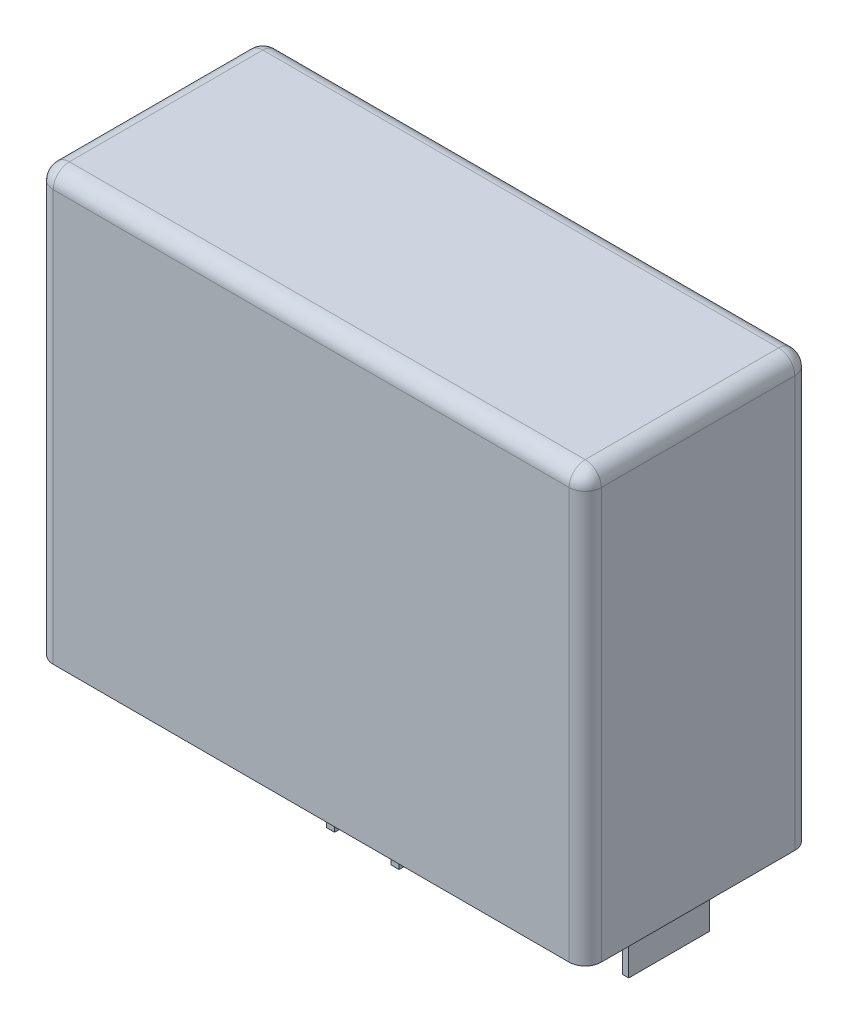
ISO-10303-21;
HEADER;
FILE_DESCRIPTION(('STEP AP214'),'2;1');
FILE_NAME('part.step','',(''),(''),'','','');
FILE_SCHEMA(('AUTOMOTIVE_DESIGN { 1 0 10303 214 1 1 1 1 }'));
ENDSEC;
DATA;
#1=APPLICATION_CONTEXT('core data for automotive mechanical design processes');
#2=APPLICATION_PROTOCOL_DEFINITION('international standard','automotive_design',2000,#1);
#3=PRODUCT_CONTEXT('',#1,'mechanical');
#4=PRODUCT('Part','Part','',(#3));
#5=PRODUCT_RELATED_PRODUCT_CATEGORY('part','',(#4));
#6=PRODUCT_DEFINITION_FORMATION('','',#4);
#7=PRODUCT_DEFINITION_CONTEXT('part definition',#1,'design');
#8=PRODUCT_DEFINITION('design','',#6,#7);
#9=PRODUCT_DEFINITION_SHAPE('','',#8);
#10=(LENGTH_UNIT() NAMED_UNIT(*) SI_UNIT(.MILLI.,.METRE.));
#11=(NAMED_UNIT(*) PLANE_ANGLE_UNIT() SI_UNIT($,.RADIAN.));
#12=(NAMED_UNIT(*) SI_UNIT($,.STERADIAN.) SOLID_ANGLE_UNIT());
#13=UNCERTAINTY_MEASURE_WITH_UNIT(LENGTH_MEASURE(1.E-05),#10,'distance_accuracy_value','');
#14=(GEOMETRIC_REPRESENTATION_CONTEXT(3) GLOBAL_UNCERTAINTY_ASSIGNED_CONTEXT((#13)) GLOBAL_UNIT_ASSIGNED_CONTEXT((#10,
#11,#12)) REPRESENTATION_CONTEXT('',''));
#15=CARTESIAN_POINT('',(0.,0.,0.));
#16=DIRECTION('',(0.,0.,1.));
#17=DIRECTION('',(1.,0.,0.));
#18=AXIS2_PLACEMENT_3D('',#15,#16,#17);
#19=CARTESIAN_POINT('',(16.,0.,-6.));
#20=DIRECTION('',(0.,-1.,0.));
#21=DIRECTION('',(0.,0.,-1.));
#22=AXIS2_PLACEMENT_3D('',#19,#20,#21);
#23=PLANE('',#22);
#24=CARTESIAN_POINT('',(16.,0.,-6.));
#25=DIRECTION('',(0.,1.,0.));
#26=DIRECTION('',(0.,0.,-1.));
#27=AXIS2_PLACEMENT_3D('',#24,#25,#26);
#28=CIRCLE('',#27,1.);
#29=CARTESIAN_POINT('',(17.,0.,-5.99999999999999));
#30=VERTEX_POINT('',#29);
#31=CARTESIAN_POINT('',(16.,0.,-7.));
#32=VERTEX_POINT('',#31);
#33=EDGE_CURVE('E326',#30,#32,#28,.T.);
#34=ORIENTED_EDGE('',*,*,#33,.F.);
#35=DIRECTION('',(0.,0.,-1.));
#36=VECTOR('',#35,1.);
#37=CARTESIAN_POINT('',(17.,0.,5.99999999999999));
#38=LINE('',#37,#36);
#39=CARTESIAN_POINT('',(17.,0.,5.99999999999999));
#40=VERTEX_POINT('',#39);
#41=EDGE_CURVE('E347',#40,#30,#38,.T.);
#42=ORIENTED_EDGE('',*,*,#41,.F.);
#43=CARTESIAN_POINT('',(16.,0.,6.));
#44=DIRECTION('',(0.,1.,0.));
#45=DIRECTION('',(0.,0.,-1.));
#46=AXIS2_PLACEMENT_3D('',#43,#44,#45);
#47=CIRCLE('',#46,1.);
#48=CARTESIAN_POINT('',(16.,0.,7.));
#49=VERTEX_POINT('',#48);
#50=EDGE_CURVE('E344',#49,#40,#47,.T.);
#51=ORIENTED_EDGE('',*,*,#50,.F.);
#52=DIRECTION('',(1.,0.,0.));
#53=VECTOR('',#52,1.);
#54=CARTESIAN_POINT('',(-16.,0.,7.));
#55=LINE('',#54,#53);
#56=CARTESIAN_POINT('',(-16.,0.,7.));
#57=VERTEX_POINT('',#56);
#58=EDGE_CURVE('E341',#57,#49,#55,.T.);
#59=ORIENTED_EDGE('',*,*,#58,.F.);
#60=CARTESIAN_POINT('',(-16.,0.,6.));
#61=DIRECTION('',(0.,1.,0.));
#62=DIRECTION('',(0.,0.,1.));
#63=AXIS2_PLACEMENT_3D('',#60,#61,#62);
#64=CIRCLE('',#63,1.);
#65=CARTESIAN_POINT('',(-17.,0.,5.99999999999999));
#66=VERTEX_POINT('',#65);
#67=EDGE_CURVE('E338',#66,#57,#64,.T.);
#68=ORIENTED_EDGE('',*,*,#67,.F.);
#69=DIRECTION('',(0.,0.,1.));
#70=VECTOR('',#69,1.);
#71=CARTESIAN_POINT('',(-17.,0.,5.99999999999999));
#72=LINE('',#71,#70);
#73=CARTESIAN_POINT('',(-17.,0.,-5.99999999999999));
#74=VERTEX_POINT('',#73);
#75=EDGE_CURVE('E335',#74,#66,#72,.T.);
#76=ORIENTED_EDGE('',*,*,#75,.F.);
#77=CARTESIAN_POINT('',(-16.,0.,-6.));
#78=DIRECTION('',(0.,1.,0.));
#79=DIRECTION('',(0.,0.,-1.));
#80=AXIS2_PLACEMENT_3D('',#77,#78,#79);
#81=CIRCLE('',#80,1.);
#82=CARTESIAN_POINT('',(-16.,0.,-7.));
#83=VERTEX_POINT('',#82);
#84=EDGE_CURVE('E332',#83,#74,#81,.T.);
#85=ORIENTED_EDGE('',*,*,#84,.F.);
#86=DIRECTION('',(-1.,0.,0.));
#87=VECTOR('',#86,1.);
#88=CARTESIAN_POINT('',(-16.,0.,-7.));
#89=LINE('',#88,#87);
#90=EDGE_CURVE('E329',#32,#83,#89,.T.);
#91=ORIENTED_EDGE('',*,*,#90,.F.);
#92=EDGE_LOOP('',(#34,#42,#51,#59,#68,#76,#85,#91));
#93=FACE_BOUND('',#92,.T.);
#94=DIRECTION('',(-1.,0.,0.));
#95=VECTOR('',#94,1.);
#96=CARTESIAN_POINT('',(-15.2,0.,2.5));
#97=LINE('',#96,#95);
#98=CARTESIAN_POINT('',(-14.8,0.,2.5));
#99=VERTEX_POINT('',#98);
#100=CARTESIAN_POINT('',(-15.2,0.,2.5));
#101=VERTEX_POINT('',#100);
#102=EDGE_CURVE('E311',#99,#101,#97,.T.);
#103=ORIENTED_EDGE('',*,*,#102,.F.);
#104=DIRECTION('',(0.,0.,1.));
#105=VECTOR('',#104,1.);
#106=CARTESIAN_POINT('',(-14.8,0.,-2.5));
#107=LINE('',#106,#105);
#108=CARTESIAN_POINT('',(-14.8,0.,-2.5));
#109=VERTEX_POINT('',#108);
#110=EDGE_CURVE('E297',#109,#99,#107,.T.);
#111=ORIENTED_EDGE('',*,*,#110,.F.);
#112=DIRECTION('',(1.,0.,0.));
#113=VECTOR('',#112,1.);
#114=CARTESIAN_POINT('',(-15.2,0.,-2.5));
#115=LINE('',#114,#113);
#116=CARTESIAN_POINT('',(-15.2,0.,-2.5));
#117=VERTEX_POINT('',#116);
#118=EDGE_CURVE('E302',#117,#109,#115,.T.);
#119=ORIENTED_EDGE('',*,*,#118,.F.);
#120=DIRECTION('',(0.,0.,-1.));
#121=VECTOR('',#120,1.);
#122=CARTESIAN_POINT('',(-15.2,0.,-2.5));
#123=LINE('',#122,#121);
#124=EDGE_CURVE('E313',#101,#117,#123,.T.);
#125=ORIENTED_EDGE('',*,*,#124,.F.);
#126=EDGE_LOOP('',(#103,#111,#119,#125));
#127=FACE_BOUND('',#126,.T.);
#128=DIRECTION('',(-1.,0.,0.));
#129=VECTOR('',#128,1.);
#130=CARTESIAN_POINT('',(14.8,0.,2.5));
#131=LINE('',#130,#129);
#132=CARTESIAN_POINT('',(15.2,0.,2.5));
#133=VERTEX_POINT('',#132);
#134=CARTESIAN_POINT('',(14.8,0.,2.5));
#135=VERTEX_POINT('',#134);
#136=EDGE_CURVE('E282',#133,#135,#131,.T.);
#137=ORIENTED_EDGE('',*,*,#136,.F.);
#138=DIRECTION('',(0.,0.,1.));
#139=VECTOR('',#138,1.);
#140=CARTESIAN_POINT('',(15.2,0.,-2.5));
#141=LINE('',#140,#139);
#142=CARTESIAN_POINT('',(15.2,0.,-2.5));
#143=VERTEX_POINT('',#142);
#144=EDGE_CURVE('E268',#143,#133,#141,.T.);
#145=ORIENTED_EDGE('',*,*,#144,.F.);
#146=DIRECTION('',(1.,0.,0.));
#147=VECTOR('',#146,1.);
#148=CARTESIAN_POINT('',(14.8,0.,-2.5));
#149=LINE('',#148,#147);
#150=CARTESIAN_POINT('',(14.8,0.,-2.5));
#151=VERTEX_POINT('',#150);
#152=EDGE_CURVE('E273',#151,#143,#149,.T.);
#153=ORIENTED_EDGE('',*,*,#152,.F.);
#154=DIRECTION('',(0.,0.,-1.));
#155=VECTOR('',#154,1.);
#156=CARTESIAN_POINT('',(14.8,0.,-2.5));
#157=LINE('',#156,#155);
#158=EDGE_CURVE('E284',#135,#151,#157,.T.);
#159=ORIENTED_EDGE('',*,*,#158,.F.);
#160=EDGE_LOOP('',(#137,#145,#153,#159));
#161=FACE_BOUND('',#160,.T.);
#162=DIRECTION('',(1.,0.,0.));
#163=VECTOR('',#162,1.);
#164=CARTESIAN_POINT('',(2.25,0.,2.8));
#165=LINE('',#164,#163);
#166=CARTESIAN_POINT('',(1.75,0.,2.8));
#167=VERTEX_POINT('',#166);
#168=CARTESIAN_POINT('',(2.25,0.,2.8));
#169=VERTEX_POINT('',#168);
#170=EDGE_CURVE('E237',#167,#169,#165,.T.);
#171=ORIENTED_EDGE('',*,*,#170,.F.);
#172=DIRECTION('',(0.,0.,-1.));
#173=VECTOR('',#172,1.);
#174=CARTESIAN_POINT('',(1.75,0.,3.8));
#175=LINE('',#174,#173);
#176=CARTESIAN_POINT('',(1.75,0.,3.8));
#177=VERTEX_POINT('',#176);
#178=EDGE_CURVE('E234',#177,#167,#175,.T.);
#179=ORIENTED_EDGE('',*,*,#178,.F.);
#180=DIRECTION('',(-1.,0.,0.));
#181=VECTOR('',#180,1.);
#182=CARTESIAN_POINT('',(2.25,0.,3.8));
#183=LINE('',#182,#181);
#184=CARTESIAN_POINT('',(2.25,0.,3.8));
#185=VERTEX_POINT('',#184);
#186=EDGE_CURVE('E247',#185,#177,#183,.T.);
#187=ORIENTED_EDGE('',*,*,#186,.F.);
#188=DIRECTION('',(0.,0.,1.));
#189=VECTOR('',#188,1.);
#190=CARTESIAN_POINT('',(2.25,0.,3.8));
#191=LINE('',#190,#189);
#192=EDGE_CURVE('E255',#169,#185,#191,.T.);
#193=ORIENTED_EDGE('',*,*,#192,.F.);
#194=EDGE_LOOP('',(#171,#179,#187,#193));
#195=FACE_BOUND('',#194,.T.);
#196=DIRECTION('',(1.,0.,0.));
#197=VECTOR('',#196,1.);
#198=CARTESIAN_POINT('',(-1.75,0.,2.8));
#199=LINE('',#198,#197);
#200=CARTESIAN_POINT('',(-2.25,0.,2.8));
#201=VERTEX_POINT('',#200);
#202=CARTESIAN_POINT('',(-1.75,0.,2.8));
#203=VERTEX_POINT('',#202);
#204=EDGE_CURVE('E413',#201,#203,#199,.T.);
#205=ORIENTED_EDGE('',*,*,#204,.F.);
#206=DIRECTION('',(0.,0.,-1.));
#207=VECTOR('',#206,1.);
#208=CARTESIAN_POINT('',(-2.25,0.,3.8));
#209=LINE('',#208,#207);
#210=CARTESIAN_POINT('',(-2.25,0.,3.8));
#211=VERTEX_POINT('',#210);
#212=EDGE_CURVE('E232',#211,#201,#209,.T.);
#213=ORIENTED_EDGE('',*,*,#212,.F.);
#214=DIRECTION('',(-1.,0.,0.));
#215=VECTOR('',#214,1.);
#216=CARTESIAN_POINT('',(-1.75,0.,3.8));
#217=LINE('',#216,#215);
#218=CARTESIAN_POINT('',(-1.75,0.,3.8));
#219=VERTEX_POINT('',#218);
#220=EDGE_CURVE('E228',#219,#211,#217,.T.);
#221=ORIENTED_EDGE('',*,*,#220,.F.);
#222=DIRECTION('',(0.,0.,1.));
#223=VECTOR('',#222,1.);
#224=CARTESIAN_POINT('',(-1.75,0.,3.8));
#225=LINE('',#224,#223);
#226=EDGE_CURVE('E415',#203,#219,#225,.T.);
#227=ORIENTED_EDGE('',*,*,#226,.F.);
#228=EDGE_LOOP('',(#205,#213,#221,#227));
#229=FACE_BOUND('',#228,.T.);
#230=ADVANCED_FACE('F35',(#93,#127,#161,#195,#229),#23,.T.);
#231=CARTESIAN_POINT('',(16.,26.5,-6.));
#232=DIRECTION('',(0.,-1.,0.));
#233=DIRECTION('',(0.,0.,-1.));
#234=AXIS2_PLACEMENT_3D('',#231,#232,#233);
#235=CYLINDRICAL_SURFACE('',#234,1.);
#236=DIRECTION('',(0.,-1.,0.));
#237=VECTOR('',#236,1.);
#238=CARTESIAN_POINT('',(16.,26.5,-7.));
#239=LINE('',#238,#237);
#240=CARTESIAN_POINT('',(16.,25.5,-7.));
#241=VERTEX_POINT('',#240);
#242=EDGE_CURVE('E364',#241,#32,#239,.T.);
#243=ORIENTED_EDGE('',*,*,#242,.F.);
#244=CARTESIAN_POINT('',(16.,25.5,-6.));
#245=DIRECTION('',(0.,-1.,0.));
#246=DIRECTION('',(0.,0.,-1.));
#247=AXIS2_PLACEMENT_3D('',#244,#245,#246);
#248=CIRCLE('',#247,1.);
#249=CARTESIAN_POINT('',(17.,25.5,-5.99999999999999));
#250=VERTEX_POINT('',#249);
#251=EDGE_CURVE('E11',#241,#250,#248,.T.);
#252=ORIENTED_EDGE('',*,*,#251,.T.);
#253=DIRECTION('',(0.,-1.,0.));
#254=VECTOR('',#253,1.);
#255=CARTESIAN_POINT('',(17.,26.5,-5.99999999999999));
#256=LINE('',#255,#254);
#257=EDGE_CURVE('E350',#250,#30,#256,.T.);
#258=ORIENTED_EDGE('',*,*,#257,.T.);
#259=ORIENTED_EDGE('',*,*,#33,.T.);
#260=EDGE_LOOP('',(#243,#252,#258,#259));
#261=FACE_BOUND('',#260,.T.);
#262=ADVANCED_FACE('F433',(#261),#235,.T.);
#263=CARTESIAN_POINT('',(-16.,26.5,-7.));
#264=DIRECTION('',(0.,0.,1.));
#265=DIRECTION('',(1.,0.,0.));
#266=AXIS2_PLACEMENT_3D('',#263,#264,#265);
#267=PLANE('',#266);
#268=DIRECTION('',(0.,-1.,0.));
#269=VECTOR('',#268,1.);
#270=CARTESIAN_POINT('',(-16.,26.5,-7.));
#271=LINE('',#270,#269);
#272=CARTESIAN_POINT('',(-16.,25.5,-7.));
#273=VERTEX_POINT('',#272);
#274=EDGE_CURVE('E362',#273,#83,#271,.T.);
#275=ORIENTED_EDGE('',*,*,#274,.F.);
#276=DIRECTION('',(-1.,0.,0.));
#277=VECTOR('',#276,1.);
#278=CARTESIAN_POINT('',(-16.,25.5,-7.));
#279=LINE('',#278,#277);
#280=EDGE_CURVE('E44',#273,#241,#279,.F.);
#281=ORIENTED_EDGE('',*,*,#280,.T.);
#282=ORIENTED_EDGE('',*,*,#242,.T.);
#283=ORIENTED_EDGE('',*,*,#90,.T.);
#284=EDGE_LOOP('',(#275,#281,#282,#283));
#285=FACE_BOUND('',#284,.T.);
#286=ADVANCED_FACE('F439',(#285),#267,.F.);
#287=CARTESIAN_POINT('',(-16.,26.5,-6.));
#288=DIRECTION('',(0.,-1.,0.));
#289=DIRECTION('',(0.,0.,-1.));
#290=AXIS2_PLACEMENT_3D('',#287,#288,#289);
#291=CYLINDRICAL_SURFACE('',#290,1.);
#292=DIRECTION('',(0.,-1.,0.));
#293=VECTOR('',#292,1.);
#294=CARTESIAN_POINT('',(-17.,26.5,-5.99999999999999));
#295=LINE('',#294,#293);
#296=CARTESIAN_POINT('',(-17.,25.5,-5.99999999999999));
#297=VERTEX_POINT('',#296);
#298=EDGE_CURVE('E360',#297,#74,#295,.T.);
#299=ORIENTED_EDGE('',*,*,#298,.F.);
#300=CARTESIAN_POINT('',(-16.,25.5,-6.));
#301=DIRECTION('',(0.,-1.,0.));
#302=DIRECTION('',(0.,0.,-1.));
#303=AXIS2_PLACEMENT_3D('',#300,#301,#302);
#304=CIRCLE('',#303,1.);
#305=EDGE_CURVE('E59',#297,#273,#304,.T.);
#306=ORIENTED_EDGE('',*,*,#305,.T.);
#307=ORIENTED_EDGE('',*,*,#274,.T.);
#308=ORIENTED_EDGE('',*,*,#84,.T.);
#309=EDGE_LOOP('',(#299,#306,#307,#308));
#310=FACE_BOUND('',#309,.T.);
#311=ADVANCED_FACE('F467',(#310),#291,.T.);
#312=CARTESIAN_POINT('',(-17.,26.5,5.99999999999999));
#313=DIRECTION('',(1.,0.,0.));
#314=DIRECTION('',(0.,0.,-1.));
#315=AXIS2_PLACEMENT_3D('',#312,#313,#314);
#316=PLANE('',#315);
#317=DIRECTION('',(0.,-1.,0.));
#318=VECTOR('',#317,1.);
#319=CARTESIAN_POINT('',(-17.,26.5,5.99999999999999));
#320=LINE('',#319,#318);
#321=CARTESIAN_POINT('',(-17.,25.5,5.99999999999999));
#322=VERTEX_POINT('',#321);
#323=EDGE_CURVE('E358',#322,#66,#320,.T.);
#324=ORIENTED_EDGE('',*,*,#323,.F.);
#325=DIRECTION('',(0.,0.,1.));
#326=VECTOR('',#325,1.);
#327=CARTESIAN_POINT('',(-17.,25.5,5.99999999999999));
#328=LINE('',#327,#326);
#329=EDGE_CURVE('E384',#322,#297,#328,.F.);
#330=ORIENTED_EDGE('',*,*,#329,.T.);
#331=ORIENTED_EDGE('',*,*,#298,.T.);
#332=ORIENTED_EDGE('',*,*,#75,.T.);
#333=EDGE_LOOP('',(#324,#330,#331,#332));
#334=FACE_BOUND('',#333,.T.);
#335=ADVANCED_FACE('F463',(#334),#316,.F.);
#336=CARTESIAN_POINT('',(-16.,26.5,6.));
#337=DIRECTION('',(0.,-1.,0.));
#338=DIRECTION('',(0.,0.,-1.));
#339=AXIS2_PLACEMENT_3D('',#336,#337,#338);
#340=CYLINDRICAL_SURFACE('',#339,1.);
#341=DIRECTION('',(0.,-1.,0.));
#342=VECTOR('',#341,1.);
#343=CARTESIAN_POINT('',(-16.,26.5,7.));
#344=LINE('',#343,#342);
#345=CARTESIAN_POINT('',(-16.,25.5,7.));
#346=VERTEX_POINT('',#345);
#347=EDGE_CURVE('E356',#346,#57,#344,.T.);
#348=ORIENTED_EDGE('',*,*,#347,.F.);
#349=CARTESIAN_POINT('',(-16.,25.5,6.));
#350=DIRECTION('',(0.,-1.,0.));
#351=DIRECTION('',(0.,0.,-1.));
#352=AXIS2_PLACEMENT_3D('',#349,#350,#351);
#353=CIRCLE('',#352,1.);
#354=EDGE_CURVE('E382',#346,#322,#353,.T.);
#355=ORIENTED_EDGE('',*,*,#354,.T.);
#356=ORIENTED_EDGE('',*,*,#323,.T.);
#357=ORIENTED_EDGE('',*,*,#67,.T.);
#358=EDGE_LOOP('',(#348,#355,#356,#357));
#359=FACE_BOUND('',#358,.T.);
#360=ADVANCED_FACE('F459',(#359),#340,.T.);
#361=CARTESIAN_POINT('',(-16.,26.5,7.));
#362=DIRECTION('',(0.,0.,-1.));
#363=DIRECTION('',(-1.,0.,0.));
#364=AXIS2_PLACEMENT_3D('',#361,#362,#363);
#365=PLANE('',#364);
#366=DIRECTION('',(0.,-1.,0.));
#367=VECTOR('',#366,1.);
#368=CARTESIAN_POINT('',(16.,26.5,7.));
#369=LINE('',#368,#367);
#370=CARTESIAN_POINT('',(16.,25.5,7.));
#371=VERTEX_POINT('',#370);
#372=EDGE_CURVE('E354',#371,#49,#369,.T.);
#373=ORIENTED_EDGE('',*,*,#372,.F.);
#374=DIRECTION('',(1.,0.,0.));
#375=VECTOR('',#374,1.);
#376=CARTESIAN_POINT('',(-16.,25.5,7.));
#377=LINE('',#376,#375);
#378=EDGE_CURVE('E380',#371,#346,#377,.F.);
#379=ORIENTED_EDGE('',*,*,#378,.T.);
#380=ORIENTED_EDGE('',*,*,#347,.T.);
#381=ORIENTED_EDGE('',*,*,#58,.T.);
#382=EDGE_LOOP('',(#373,#379,#380,#381));
#383=FACE_BOUND('',#382,.T.);
#384=ADVANCED_FACE('F455',(#383),#365,.F.);
#385=CARTESIAN_POINT('',(16.,26.5,6.));
#386=DIRECTION('',(0.,-1.,0.));
#387=DIRECTION('',(0.,0.,-1.));
#388=AXIS2_PLACEMENT_3D('',#385,#386,#387);
#389=CYLINDRICAL_SURFACE('',#388,1.);
#390=DIRECTION('',(0.,-1.,0.));
#391=VECTOR('',#390,1.);
#392=CARTESIAN_POINT('',(17.,26.5,5.99999999999999));
#393=LINE('',#392,#391);
#394=CARTESIAN_POINT('',(17.,25.5,5.99999999999999));
#395=VERTEX_POINT('',#394);
#396=EDGE_CURVE('E352',#395,#40,#393,.T.);
#397=ORIENTED_EDGE('',*,*,#396,.F.);
#398=CARTESIAN_POINT('',(16.,25.5,6.));
#399=DIRECTION('',(0.,-1.,0.));
#400=DIRECTION('',(0.,0.,-1.));
#401=AXIS2_PLACEMENT_3D('',#398,#399,#400);
#402=CIRCLE('',#401,1.);
#403=EDGE_CURVE('E378',#395,#371,#402,.T.);
#404=ORIENTED_EDGE('',*,*,#403,.T.);
#405=ORIENTED_EDGE('',*,*,#372,.T.);
#406=ORIENTED_EDGE('',*,*,#50,.T.);
#407=EDGE_LOOP('',(#397,#404,#405,#406));
#408=FACE_BOUND('',#407,.T.);
#409=ADVANCED_FACE('F451',(#408),#389,.T.);
#410=CARTESIAN_POINT('',(17.,26.5,5.99999999999999));
#411=DIRECTION('',(-1.,0.,0.));
#412=DIRECTION('',(0.,0.,1.));
#413=AXIS2_PLACEMENT_3D('',#410,#411,#412);
#414=PLANE('',#413);
#415=ORIENTED_EDGE('',*,*,#257,.F.);
#416=DIRECTION('',(0.,0.,-1.));
#417=VECTOR('',#416,1.);
#418=CARTESIAN_POINT('',(17.,25.5,5.99999999999999));
#419=LINE('',#418,#417);
#420=EDGE_CURVE('E375',#250,#395,#419,.F.);
#421=ORIENTED_EDGE('',*,*,#420,.T.);
#422=ORIENTED_EDGE('',*,*,#396,.T.);
#423=ORIENTED_EDGE('',*,*,#41,.T.);
#424=EDGE_LOOP('',(#415,#421,#422,#423));
#425=FACE_BOUND('',#424,.T.);
#426=ADVANCED_FACE('F448',(#425),#414,.F.);
#427=CARTESIAN_POINT('',(16.,26.5,-6.));
#428=DIRECTION('',(0.,-1.,0.));
#429=DIRECTION('',(0.,0.,-1.));
#430=AXIS2_PLACEMENT_3D('',#427,#428,#429);
#431=PLANE('',#430);
#432=DIRECTION('',(1.,0.,0.));
#433=VECTOR('',#432,1.);
#434=CARTESIAN_POINT('',(16.,26.5,6.));
#435=LINE('',#434,#433);
#436=CARTESIAN_POINT('',(-16.,26.5,6.));
#437=VERTEX_POINT('',#436);
#438=CARTESIAN_POINT('',(16.,26.5,6.));
#439=VERTEX_POINT('',#438);
#440=EDGE_CURVE('E370',#437,#439,#435,.T.);
#441=ORIENTED_EDGE('',*,*,#440,.T.);
#442=DIRECTION('',(0.,0.,-1.));
#443=VECTOR('',#442,1.);
#444=CARTESIAN_POINT('',(16.,26.5,-6.));
#445=LINE('',#444,#443);
#446=CARTESIAN_POINT('',(16.,26.5,-6.));
#447=VERTEX_POINT('',#446);
#448=EDGE_CURVE('E372',#439,#447,#445,.T.);
#449=ORIENTED_EDGE('',*,*,#448,.T.);
#450=DIRECTION('',(-1.,0.,0.));
#451=VECTOR('',#450,1.);
#452=CARTESIAN_POINT('',(16.,26.5,-6.));
#453=LINE('',#452,#451);
#454=CARTESIAN_POINT('',(-16.,26.5,-6.));
#455=VERTEX_POINT('',#454);
#456=EDGE_CURVE('E366',#447,#455,#453,.T.);
#457=ORIENTED_EDGE('',*,*,#456,.T.);
#458=DIRECTION('',(0.,0.,1.));
#459=VECTOR('',#458,1.);
#460=CARTESIAN_POINT('',(-16.,26.5,-6.));
#461=LINE('',#460,#459);
#462=EDGE_CURVE('E368',#455,#437,#461,.T.);
#463=ORIENTED_EDGE('',*,*,#462,.T.);
#464=EDGE_LOOP('',(#441,#449,#457,#463));
#465=FACE_BOUND('',#464,.T.);
#466=ADVANCED_FACE('F446',(#465),#431,.F.);
#467=CARTESIAN_POINT('',(-14.8,-3.5,-2.5));
#468=DIRECTION('',(-1.,0.,0.));
#469=DIRECTION('',(0.,0.,1.));
#470=AXIS2_PLACEMENT_3D('',#467,#468,#469);
#471=PLANE('',#470);
#472=ORIENTED_EDGE('',*,*,#110,.T.);
#473=DIRECTION('',(0.,1.,0.));
#474=VECTOR('',#473,1.);
#475=CARTESIAN_POINT('',(-14.8,-3.5,2.5));
#476=LINE('',#475,#474);
#477=CARTESIAN_POINT('',(-14.8,-3.5,2.5));
#478=VERTEX_POINT('',#477);
#479=EDGE_CURVE('E324',#478,#99,#476,.T.);
#480=ORIENTED_EDGE('',*,*,#479,.F.);
#481=DIRECTION('',(0.,0.,1.));
#482=VECTOR('',#481,1.);
#483=CARTESIAN_POINT('',(-14.8,-3.5,-2.5));
#484=LINE('',#483,#482);
#485=CARTESIAN_POINT('',(-14.8,-3.5,-2.5));
#486=VERTEX_POINT('',#485);
#487=EDGE_CURVE('E298',#486,#478,#484,.T.);
#488=ORIENTED_EDGE('',*,*,#487,.F.);
#489=DIRECTION('',(0.,1.,0.));
#490=VECTOR('',#489,1.);
#491=CARTESIAN_POINT('',(-14.8,-3.5,-2.5));
#492=LINE('',#491,#490);
#493=EDGE_CURVE('E308',#486,#109,#492,.T.);
#494=ORIENTED_EDGE('',*,*,#493,.T.);
#495=EDGE_LOOP('',(#472,#480,#488,#494));
#496=FACE_BOUND('',#495,.T.);
#497=ADVANCED_FACE('F532',(#496),#471,.F.);
#498=CARTESIAN_POINT('',(-15.2,-3.5,2.5));
#499=DIRECTION('',(0.,0.,-1.));
#500=DIRECTION('',(-1.,0.,0.));
#501=AXIS2_PLACEMENT_3D('',#498,#499,#500);
#502=PLANE('',#501);
#503=ORIENTED_EDGE('',*,*,#102,.T.);
#504=DIRECTION('',(0.,1.,0.));
#505=VECTOR('',#504,1.);
#506=CARTESIAN_POINT('',(-15.2,-3.5,2.5));
#507=LINE('',#506,#505);
#508=CARTESIAN_POINT('',(-15.2,-3.5,2.5));
#509=VERTEX_POINT('',#508);
#510=EDGE_CURVE('E321',#509,#101,#507,.T.);
#511=ORIENTED_EDGE('',*,*,#510,.F.);
#512=DIRECTION('',(-1.,0.,0.));
#513=VECTOR('',#512,1.);
#514=CARTESIAN_POINT('',(-15.2,-3.5,2.5));
#515=LINE('',#514,#513);
#516=EDGE_CURVE('E301',#478,#509,#515,.T.);
#517=ORIENTED_EDGE('',*,*,#516,.F.);
#518=ORIENTED_EDGE('',*,*,#479,.T.);
#519=EDGE_LOOP('',(#503,#511,#517,#518));
#520=FACE_BOUND('',#519,.T.);
#521=ADVANCED_FACE('F536',(#520),#502,.F.);
#522=CARTESIAN_POINT('',(-15.2,-3.5,-2.5));
#523=DIRECTION('',(1.,0.,0.));
#524=DIRECTION('',(0.,0.,-1.));
#525=AXIS2_PLACEMENT_3D('',#522,#523,#524);
#526=PLANE('',#525);
#527=ORIENTED_EDGE('',*,*,#124,.T.);
#528=DIRECTION('',(0.,1.,0.));
#529=VECTOR('',#528,1.);
#530=CARTESIAN_POINT('',(-15.2,-3.5,-2.5));
#531=LINE('',#530,#529);
#532=CARTESIAN_POINT('',(-15.2,-3.5,-2.5));
#533=VERTEX_POINT('',#532);
#534=EDGE_CURVE('E319',#533,#117,#531,.T.);
#535=ORIENTED_EDGE('',*,*,#534,.F.);
#536=DIRECTION('',(0.,0.,-1.));
#537=VECTOR('',#536,1.);
#538=CARTESIAN_POINT('',(-15.2,-3.5,-2.5));
#539=LINE('',#538,#537);
#540=EDGE_CURVE('E304',#509,#533,#539,.T.);
#541=ORIENTED_EDGE('',*,*,#540,.F.);
#542=ORIENTED_EDGE('',*,*,#510,.T.);
#543=EDGE_LOOP('',(#527,#535,#541,#542));
#544=FACE_BOUND('',#543,.T.);
#545=ADVANCED_FACE('F541',(#544),#526,.F.);
#546=CARTESIAN_POINT('',(-15.2,-3.5,-2.5));
#547=DIRECTION('',(0.,0.,1.));
#548=DIRECTION('',(1.,0.,0.));
#549=AXIS2_PLACEMENT_3D('',#546,#547,#548);
#550=PLANE('',#549);
#551=ORIENTED_EDGE('',*,*,#118,.T.);
#552=ORIENTED_EDGE('',*,*,#493,.F.);
#553=DIRECTION('',(1.,0.,0.));
#554=VECTOR('',#553,1.);
#555=CARTESIAN_POINT('',(-15.2,-3.5,-2.5));
#556=LINE('',#555,#554);
#557=EDGE_CURVE('E306',#533,#486,#556,.T.);
#558=ORIENTED_EDGE('',*,*,#557,.F.);
#559=ORIENTED_EDGE('',*,*,#534,.T.);
#560=EDGE_LOOP('',(#551,#552,#558,#559));
#561=FACE_BOUND('',#560,.T.);
#562=ADVANCED_FACE('F547',(#561),#550,.F.);
#563=CARTESIAN_POINT('',(0.,-3.5,0.));
#564=DIRECTION('',(0.,1.,0.));
#565=DIRECTION('',(0.,0.,1.));
#566=AXIS2_PLACEMENT_3D('',#563,#564,#565);
#567=PLANE('',#566);
#568=ORIENTED_EDGE('',*,*,#487,.T.);
#569=ORIENTED_EDGE('',*,*,#516,.T.);
#570=ORIENTED_EDGE('',*,*,#540,.T.);
#571=ORIENTED_EDGE('',*,*,#557,.T.);
#572=EDGE_LOOP('',(#568,#569,#570,#571));
#573=FACE_BOUND('',#572,.T.);
#574=ADVANCED_FACE('F551',(#573),#567,.F.);
#575=CARTESIAN_POINT('',(15.2,-3.5,-2.5));
#576=DIRECTION('',(-1.,0.,0.));
#577=DIRECTION('',(0.,0.,1.));
#578=AXIS2_PLACEMENT_3D('',#575,#576,#577);
#579=PLANE('',#578);
#580=ORIENTED_EDGE('',*,*,#144,.T.);
#581=DIRECTION('',(0.,1.,0.));
#582=VECTOR('',#581,1.);
#583=CARTESIAN_POINT('',(15.2,-3.5,2.5));
#584=LINE('',#583,#582);
#585=CARTESIAN_POINT('',(15.2,-3.5,2.5));
#586=VERTEX_POINT('',#585);
#587=EDGE_CURVE('E295',#586,#133,#584,.T.);
#588=ORIENTED_EDGE('',*,*,#587,.F.);
#589=DIRECTION('',(0.,0.,1.));
#590=VECTOR('',#589,1.);
#591=CARTESIAN_POINT('',(15.2,-3.5,-2.5));
#592=LINE('',#591,#590);
#593=CARTESIAN_POINT('',(15.2,-3.5,-2.5));
#594=VERTEX_POINT('',#593);
#595=EDGE_CURVE('E269',#594,#586,#592,.T.);
#596=ORIENTED_EDGE('',*,*,#595,.F.);
#597=DIRECTION('',(0.,1.,0.));
#598=VECTOR('',#597,1.);
#599=CARTESIAN_POINT('',(15.2,-3.5,-2.5));
#600=LINE('',#599,#598);
#601=EDGE_CURVE('E279',#594,#143,#600,.T.);
#602=ORIENTED_EDGE('',*,*,#601,.T.);
#603=EDGE_LOOP('',(#580,#588,#596,#602));
#604=FACE_BOUND('',#603,.T.);
#605=ADVANCED_FACE('F555',(#604),#579,.F.);
#606=CARTESIAN_POINT('',(14.8,-3.5,2.5));
#607=DIRECTION('',(0.,0.,-1.));
#608=DIRECTION('',(-1.,0.,0.));
#609=AXIS2_PLACEMENT_3D('',#606,#607,#608);
#610=PLANE('',#609);
#611=ORIENTED_EDGE('',*,*,#136,.T.);
#612=DIRECTION('',(0.,1.,0.));
#613=VECTOR('',#612,1.);
#614=CARTESIAN_POINT('',(14.8,-3.5,2.5));
#615=LINE('',#614,#613);
#616=CARTESIAN_POINT('',(14.8,-3.5,2.5));
#617=VERTEX_POINT('',#616);
#618=EDGE_CURVE('E292',#617,#135,#615,.T.);
#619=ORIENTED_EDGE('',*,*,#618,.F.);
#620=DIRECTION('',(-1.,0.,0.));
#621=VECTOR('',#620,1.);
#622=CARTESIAN_POINT('',(14.8,-3.5,2.5));
#623=LINE('',#622,#621);
#624=EDGE_CURVE('E272',#586,#617,#623,.T.);
#625=ORIENTED_EDGE('',*,*,#624,.F.);
#626=ORIENTED_EDGE('',*,*,#587,.T.);
#627=EDGE_LOOP('',(#611,#619,#625,#626));
#628=FACE_BOUND('',#627,.T.);
#629=ADVANCED_FACE('F559',(#628),#610,.F.);
#630=CARTESIAN_POINT('',(14.8,-3.5,-2.5));
#631=DIRECTION('',(1.,0.,0.));
#632=DIRECTION('',(0.,0.,-1.));
#633=AXIS2_PLACEMENT_3D('',#630,#631,#632);
#634=PLANE('',#633);
#635=ORIENTED_EDGE('',*,*,#158,.T.);
#636=DIRECTION('',(0.,1.,0.));
#637=VECTOR('',#636,1.);
#638=CARTESIAN_POINT('',(14.8,-3.5,-2.5));
#639=LINE('',#638,#637);
#640=CARTESIAN_POINT('',(14.8,-3.5,-2.5));
#641=VERTEX_POINT('',#640);
#642=EDGE_CURVE('E290',#641,#151,#639,.T.);
#643=ORIENTED_EDGE('',*,*,#642,.F.);
#644=DIRECTION('',(0.,0.,-1.));
#645=VECTOR('',#644,1.);
#646=CARTESIAN_POINT('',(14.8,-3.5,-2.5));
#647=LINE('',#646,#645);
#648=EDGE_CURVE('E275',#617,#641,#647,.T.);
#649=ORIENTED_EDGE('',*,*,#648,.F.);
#650=ORIENTED_EDGE('',*,*,#618,.T.);
#651=EDGE_LOOP('',(#635,#643,#649,#650));
#652=FACE_BOUND('',#651,.T.);
#653=ADVANCED_FACE('F563',(#652),#634,.F.);
#654=CARTESIAN_POINT('',(14.8,-3.5,-2.5));
#655=DIRECTION('',(0.,0.,1.));
#656=DIRECTION('',(1.,0.,0.));
#657=AXIS2_PLACEMENT_3D('',#654,#655,#656);
#658=PLANE('',#657);
#659=ORIENTED_EDGE('',*,*,#152,.T.);
#660=ORIENTED_EDGE('',*,*,#601,.F.);
#661=DIRECTION('',(1.,0.,0.));
#662=VECTOR('',#661,1.);
#663=CARTESIAN_POINT('',(14.8,-3.5,-2.5));
#664=LINE('',#663,#662);
#665=EDGE_CURVE('E277',#641,#594,#664,.T.);
#666=ORIENTED_EDGE('',*,*,#665,.F.);
#667=ORIENTED_EDGE('',*,*,#642,.T.);
#668=EDGE_LOOP('',(#659,#660,#666,#667));
#669=FACE_BOUND('',#668,.T.);
#670=ADVANCED_FACE('F567',(#669),#658,.F.);
#671=CARTESIAN_POINT('',(0.,-3.5,0.));
#672=DIRECTION('',(0.,1.,0.));
#673=DIRECTION('',(0.,0.,1.));
#674=AXIS2_PLACEMENT_3D('',#671,#672,#673);
#675=PLANE('',#674);
#676=ORIENTED_EDGE('',*,*,#595,.T.);
#677=ORIENTED_EDGE('',*,*,#624,.T.);
#678=ORIENTED_EDGE('',*,*,#648,.T.);
#679=ORIENTED_EDGE('',*,*,#665,.T.);
#680=EDGE_LOOP('',(#676,#677,#678,#679));
#681=FACE_BOUND('',#680,.T.);
#682=ADVANCED_FACE('F571',(#681),#675,.F.);
#683=CARTESIAN_POINT('',(1.75,-3.5,3.8));
#684=DIRECTION('',(1.,0.,0.));
#685=DIRECTION('',(0.,0.,-1.));
#686=AXIS2_PLACEMENT_3D('',#683,#684,#685);
#687=PLANE('',#686);
#688=ORIENTED_EDGE('',*,*,#178,.T.);
#689=DIRECTION('',(0.,1.,0.));
#690=VECTOR('',#689,1.);
#691=CARTESIAN_POINT('',(1.75,-3.5,2.8));
#692=LINE('',#691,#690);
#693=CARTESIAN_POINT('',(1.75,-3.5,2.8));
#694=VERTEX_POINT('',#693);
#695=EDGE_CURVE('E266',#694,#167,#692,.T.);
#696=ORIENTED_EDGE('',*,*,#695,.F.);
#697=DIRECTION('',(0.,0.,-1.));
#698=VECTOR('',#697,1.);
#699=CARTESIAN_POINT('',(1.75,-3.5,3.8));
#700=LINE('',#699,#698);
#701=CARTESIAN_POINT('',(1.75,-3.5,3.8));
#702=VERTEX_POINT('',#701);
#703=EDGE_CURVE('E243',#702,#694,#700,.T.);
#704=ORIENTED_EDGE('',*,*,#703,.F.);
#705=DIRECTION('',(0.,1.,0.));
#706=VECTOR('',#705,1.);
#707=CARTESIAN_POINT('',(1.75,-3.5,3.8));
#708=LINE('',#707,#706);
#709=EDGE_CURVE('E252',#702,#177,#708,.T.);
#710=ORIENTED_EDGE('',*,*,#709,.T.);
#711=EDGE_LOOP('',(#688,#696,#704,#710));
#712=FACE_BOUND('',#711,.T.);
#713=ADVANCED_FACE('F575',(#712),#687,.F.);
#714=CARTESIAN_POINT('',(2.25,-3.5,2.8));
#715=DIRECTION('',(0.,0.,1.));
#716=DIRECTION('',(1.,0.,0.));
#717=AXIS2_PLACEMENT_3D('',#714,#715,#716);
#718=PLANE('',#717);
#719=ORIENTED_EDGE('',*,*,#170,.T.);
#720=DIRECTION('',(0.,1.,0.));
#721=VECTOR('',#720,1.);
#722=CARTESIAN_POINT('',(2.25,-3.5,2.8));
#723=LINE('',#722,#721);
#724=CARTESIAN_POINT('',(2.25,-3.5,2.8));
#725=VERTEX_POINT('',#724);
#726=EDGE_CURVE('E263',#725,#169,#723,.T.);
#727=ORIENTED_EDGE('',*,*,#726,.F.);
#728=DIRECTION('',(1.,0.,0.));
#729=VECTOR('',#728,1.);
#730=CARTESIAN_POINT('',(2.25,-3.5,2.8));
#731=LINE('',#730,#729);
#732=EDGE_CURVE('E246',#694,#725,#731,.T.);
#733=ORIENTED_EDGE('',*,*,#732,.F.);
#734=ORIENTED_EDGE('',*,*,#695,.T.);
#735=EDGE_LOOP('',(#719,#727,#733,#734));
#736=FACE_BOUND('',#735,.T.);
#737=ADVANCED_FACE('F579',(#736),#718,.F.);
#738=CARTESIAN_POINT('',(2.25,-3.5,3.8));
#739=DIRECTION('',(-1.,0.,0.));
#740=DIRECTION('',(0.,0.,1.));
#741=AXIS2_PLACEMENT_3D('',#738,#739,#740);
#742=PLANE('',#741);
#743=ORIENTED_EDGE('',*,*,#192,.T.);
#744=DIRECTION('',(0.,1.,0.));
#745=VECTOR('',#744,1.);
#746=CARTESIAN_POINT('',(2.25,-3.5,3.8));
#747=LINE('',#746,#745);
#748=CARTESIAN_POINT('',(2.25,-3.5,3.8));
#749=VERTEX_POINT('',#748);
#750=EDGE_CURVE('E261',#749,#185,#747,.T.);
#751=ORIENTED_EDGE('',*,*,#750,.F.);
#752=DIRECTION('',(0.,0.,1.));
#753=VECTOR('',#752,1.);
#754=CARTESIAN_POINT('',(2.25,-3.5,3.8));
#755=LINE('',#754,#753);
#756=EDGE_CURVE('E249',#725,#749,#755,.T.);
#757=ORIENTED_EDGE('',*,*,#756,.F.);
#758=ORIENTED_EDGE('',*,*,#726,.T.);
#759=EDGE_LOOP('',(#743,#751,#757,#758));
#760=FACE_BOUND('',#759,.T.);
#761=ADVANCED_FACE('F583',(#760),#742,.F.);
#762=CARTESIAN_POINT('',(2.25,-3.5,3.8));
#763=DIRECTION('',(0.,0.,-1.));
#764=DIRECTION('',(-1.,0.,0.));
#765=AXIS2_PLACEMENT_3D('',#762,#763,#764);
#766=PLANE('',#765);
#767=ORIENTED_EDGE('',*,*,#186,.T.);
#768=ORIENTED_EDGE('',*,*,#709,.F.);
#769=DIRECTION('',(-1.,0.,0.));
#770=VECTOR('',#769,1.);
#771=CARTESIAN_POINT('',(2.25,-3.5,3.8));
#772=LINE('',#771,#770);
#773=EDGE_CURVE('E251',#749,#702,#772,.T.);
#774=ORIENTED_EDGE('',*,*,#773,.F.);
#775=ORIENTED_EDGE('',*,*,#750,.T.);
#776=EDGE_LOOP('',(#767,#768,#774,#775));
#777=FACE_BOUND('',#776,.T.);
#778=ADVANCED_FACE('F587',(#777),#766,.F.);
#779=CARTESIAN_POINT('',(0.,-3.5,0.));
#780=DIRECTION('',(0.,1.,0.));
#781=DIRECTION('',(0.,0.,1.));
#782=AXIS2_PLACEMENT_3D('',#779,#780,#781);
#783=PLANE('',#782);
#784=ORIENTED_EDGE('',*,*,#703,.T.);
#785=ORIENTED_EDGE('',*,*,#732,.T.);
#786=ORIENTED_EDGE('',*,*,#756,.T.);
#787=ORIENTED_EDGE('',*,*,#773,.T.);
#788=EDGE_LOOP('',(#784,#785,#786,#787));
#789=FACE_BOUND('',#788,.T.);
#790=ADVANCED_FACE('F591',(#789),#783,.F.);
#791=CARTESIAN_POINT('',(-2.25,-3.5,3.8));
#792=DIRECTION('',(1.,0.,0.));
#793=DIRECTION('',(0.,0.,-1.));
#794=AXIS2_PLACEMENT_3D('',#791,#792,#793);
#795=PLANE('',#794);
#796=ORIENTED_EDGE('',*,*,#212,.T.);
#797=DIRECTION('',(0.,1.,0.));
#798=VECTOR('',#797,1.);
#799=CARTESIAN_POINT('',(-2.25,-3.5,2.8));
#800=LINE('',#799,#798);
#801=CARTESIAN_POINT('',(-2.25,-3.5,2.8));
#802=VERTEX_POINT('',#801);
#803=EDGE_CURVE('E212',#802,#201,#800,.T.);
#804=ORIENTED_EDGE('',*,*,#803,.F.);
#805=DIRECTION('',(0.,0.,-1.));
#806=VECTOR('',#805,1.);
#807=CARTESIAN_POINT('',(-2.25,-3.5,3.8));
#808=LINE('',#807,#806);
#809=CARTESIAN_POINT('',(-2.25,-3.5,3.8));
#810=VERTEX_POINT('',#809);
#811=EDGE_CURVE('E219',#810,#802,#808,.T.);
#812=ORIENTED_EDGE('',*,*,#811,.F.);
#813=DIRECTION('',(0.,1.,0.));
#814=VECTOR('',#813,1.);
#815=CARTESIAN_POINT('',(-2.25,-3.5,3.8));
#816=LINE('',#815,#814);
#817=EDGE_CURVE('E423',#810,#211,#816,.T.);
#818=ORIENTED_EDGE('',*,*,#817,.T.);
#819=EDGE_LOOP('',(#796,#804,#812,#818));
#820=FACE_BOUND('',#819,.T.);
#821=ADVANCED_FACE('F230',(#820),#795,.F.);
#822=CARTESIAN_POINT('',(-1.75,-3.5,2.8));
#823=DIRECTION('',(0.,0.,1.));
#824=DIRECTION('',(1.,0.,0.));
#825=AXIS2_PLACEMENT_3D('',#822,#823,#824);
#826=PLANE('',#825);
#827=ORIENTED_EDGE('',*,*,#204,.T.);
#828=DIRECTION('',(0.,1.,0.));
#829=VECTOR('',#828,1.);
#830=CARTESIAN_POINT('',(-1.75,-3.5,2.8));
#831=LINE('',#830,#829);
#832=CARTESIAN_POINT('',(-1.75,-3.5,2.8));
#833=VERTEX_POINT('',#832);
#834=EDGE_CURVE('E215',#833,#203,#831,.T.);
#835=ORIENTED_EDGE('',*,*,#834,.F.);
#836=DIRECTION('',(1.,0.,0.));
#837=VECTOR('',#836,1.);
#838=CARTESIAN_POINT('',(-1.75,-3.5,2.8));
#839=LINE('',#838,#837);
#840=EDGE_CURVE('E208',#802,#833,#839,.T.);
#841=ORIENTED_EDGE('',*,*,#840,.F.);
#842=ORIENTED_EDGE('',*,*,#803,.T.);
#843=EDGE_LOOP('',(#827,#835,#841,#842));
#844=FACE_BOUND('',#843,.T.);
#845=ADVANCED_FACE('F210',(#844),#826,.F.);
#846=CARTESIAN_POINT('',(-1.75,-3.5,3.8));
#847=DIRECTION('',(-1.,0.,0.));
#848=DIRECTION('',(0.,0.,1.));
#849=AXIS2_PLACEMENT_3D('',#846,#847,#848);
#850=PLANE('',#849);
#851=ORIENTED_EDGE('',*,*,#226,.T.);
#852=DIRECTION('',(0.,1.,0.));
#853=VECTOR('',#852,1.);
#854=CARTESIAN_POINT('',(-1.75,-3.5,3.8));
#855=LINE('',#854,#853);
#856=CARTESIAN_POINT('',(-1.75,-3.5,3.8));
#857=VERTEX_POINT('',#856);
#858=EDGE_CURVE('E239',#857,#219,#855,.T.);
#859=ORIENTED_EDGE('',*,*,#858,.F.);
#860=DIRECTION('',(0.,0.,1.));
#861=VECTOR('',#860,1.);
#862=CARTESIAN_POINT('',(-1.75,-3.5,3.8));
#863=LINE('',#862,#861);
#864=EDGE_CURVE('E218',#833,#857,#863,.T.);
#865=ORIENTED_EDGE('',*,*,#864,.F.);
#866=ORIENTED_EDGE('',*,*,#834,.T.);
#867=EDGE_LOOP('',(#851,#859,#865,#866));
#868=FACE_BOUND('',#867,.T.);
#869=ADVANCED_FACE('F430',(#868),#850,.F.);
#870=CARTESIAN_POINT('',(-1.75,-3.5,3.8));
#871=DIRECTION('',(0.,0.,-1.));
#872=DIRECTION('',(-1.,0.,0.));
#873=AXIS2_PLACEMENT_3D('',#870,#871,#872);
#874=PLANE('',#873);
#875=ORIENTED_EDGE('',*,*,#220,.T.);
#876=ORIENTED_EDGE('',*,*,#817,.F.);
#877=DIRECTION('',(-1.,0.,0.));
#878=VECTOR('',#877,1.);
#879=CARTESIAN_POINT('',(-1.75,-3.5,3.8));
#880=LINE('',#879,#878);
#881=EDGE_CURVE('E224',#857,#810,#880,.T.);
#882=ORIENTED_EDGE('',*,*,#881,.F.);
#883=ORIENTED_EDGE('',*,*,#858,.T.);
#884=EDGE_LOOP('',(#875,#876,#882,#883));
#885=FACE_BOUND('',#884,.T.);
#886=ADVANCED_FACE('F426',(#885),#874,.F.);
#887=CARTESIAN_POINT('',(0.,-3.5,0.));
#888=DIRECTION('',(0.,1.,0.));
#889=DIRECTION('',(0.,0.,1.));
#890=AXIS2_PLACEMENT_3D('',#887,#888,#889);
#891=PLANE('',#890);
#892=ORIENTED_EDGE('',*,*,#811,.T.);
#893=ORIENTED_EDGE('',*,*,#840,.T.);
#894=ORIENTED_EDGE('',*,*,#864,.T.);
#895=ORIENTED_EDGE('',*,*,#881,.T.);
#896=EDGE_LOOP('',(#892,#893,#894,#895));
#897=FACE_BOUND('',#896,.T.);
#898=ADVANCED_FACE('F222',(#897),#891,.F.);
#899=CARTESIAN_POINT('',(-16.,25.5,-6.));
#900=DIRECTION('',(0.,0.,1.));
#901=DIRECTION('',(1.,0.,0.));
#902=AXIS2_PLACEMENT_3D('',#899,#900,#901);
#903=CYLINDRICAL_SURFACE('',#902,1.);
#904=CARTESIAN_POINT('',(-16.,25.5,-5.99999999999999));
#905=DIRECTION('',(0.,0.,-1.));
#906=DIRECTION('',(-1.,0.,0.));
#907=AXIS2_PLACEMENT_3D('',#904,#905,#906);
#908=CIRCLE('',#907,1.);
#909=EDGE_CURVE('E403',#297,#455,#908,.T.);
#910=ORIENTED_EDGE('',*,*,#909,.F.);
#911=ORIENTED_EDGE('',*,*,#329,.F.);
#912=CARTESIAN_POINT('',(-16.,25.5,6.));
#913=DIRECTION('',(0.,0.,1.));
#914=DIRECTION('',(1.,0.,0.));
#915=AXIS2_PLACEMENT_3D('',#912,#913,#914);
#916=CIRCLE('',#915,1.);
#917=EDGE_CURVE('E39',#437,#322,#916,.T.);
#918=ORIENTED_EDGE('',*,*,#917,.F.);
#919=ORIENTED_EDGE('',*,*,#462,.F.);
#920=EDGE_LOOP('',(#910,#911,#918,#919));
#921=FACE_BOUND('',#920,.T.);
#922=ADVANCED_FACE('F37',(#921),#903,.T.);
#923=CARTESIAN_POINT('',(-16.,25.5,6.));
#924=DIRECTION('',(0.,-1.,0.));
#925=DIRECTION('',(0.,0.,-1.));
#926=AXIS2_PLACEMENT_3D('',#923,#924,#925);
#927=SPHERICAL_SURFACE('',#926,1.);
#928=ORIENTED_EDGE('',*,*,#917,.T.);
#929=ORIENTED_EDGE('',*,*,#354,.F.);
#930=CARTESIAN_POINT('',(-16.,25.5,6.));
#931=DIRECTION('',(1.,0.,0.));
#932=DIRECTION('',(0.,0.,-1.));
#933=AXIS2_PLACEMENT_3D('',#930,#931,#932);
#934=CIRCLE('',#933,1.);
#935=EDGE_CURVE('E401',#437,#346,#934,.T.);
#936=ORIENTED_EDGE('',*,*,#935,.F.);
#937=EDGE_LOOP('',(#928,#929,#936));
#938=FACE_BOUND('',#937,.T.);
#939=ADVANCED_FACE('F495',(#938),#927,.T.);
#940=CARTESIAN_POINT('',(-16.,25.5,-6.));
#941=DIRECTION('',(0.,-1.,0.));
#942=DIRECTION('',(0.,0.,-1.));
#943=AXIS2_PLACEMENT_3D('',#940,#941,#942);
#944=SPHERICAL_SURFACE('',#943,1.);
#945=ORIENTED_EDGE('',*,*,#305,.F.);
#946=ORIENTED_EDGE('',*,*,#909,.T.);
#947=CARTESIAN_POINT('',(-16.,25.5,-6.));
#948=DIRECTION('',(1.,0.,0.));
#949=DIRECTION('',(0.,0.,-1.));
#950=AXIS2_PLACEMENT_3D('',#947,#948,#949);
#951=CIRCLE('',#950,1.);
#952=EDGE_CURVE('E398',#273,#455,#951,.T.);
#953=ORIENTED_EDGE('',*,*,#952,.F.);
#954=EDGE_LOOP('',(#945,#946,#953));
#955=FACE_BOUND('',#954,.T.);
#956=ADVANCED_FACE('F492',(#955),#944,.T.);
#957=CARTESIAN_POINT('',(16.,25.5,6.));
#958=DIRECTION('',(1.,0.,0.));
#959=DIRECTION('',(0.,0.,-1.));
#960=AXIS2_PLACEMENT_3D('',#957,#958,#959);
#961=CYLINDRICAL_SURFACE('',#960,1.);
#962=ORIENTED_EDGE('',*,*,#935,.T.);
#963=ORIENTED_EDGE('',*,*,#378,.F.);
#964=CARTESIAN_POINT('',(16.,25.5,6.));
#965=DIRECTION('',(1.,0.,0.));
#966=DIRECTION('',(0.,0.,-1.));
#967=AXIS2_PLACEMENT_3D('',#964,#965,#966);
#968=CIRCLE('',#967,1.);
#969=EDGE_CURVE('E395',#439,#371,#968,.T.);
#970=ORIENTED_EDGE('',*,*,#969,.F.);
#971=ORIENTED_EDGE('',*,*,#440,.F.);
#972=EDGE_LOOP('',(#962,#963,#970,#971));
#973=FACE_BOUND('',#972,.T.);
#974=ADVANCED_FACE('F488',(#973),#961,.T.);
#975=CARTESIAN_POINT('',(16.,25.5,-6.));
#976=DIRECTION('',(-1.,0.,0.));
#977=DIRECTION('',(0.,0.,1.));
#978=AXIS2_PLACEMENT_3D('',#975,#976,#977);
#979=CYLINDRICAL_SURFACE('',#978,1.);
#980=ORIENTED_EDGE('',*,*,#952,.T.);
#981=ORIENTED_EDGE('',*,*,#456,.F.);
#982=CARTESIAN_POINT('',(16.,25.5,-6.));
#983=DIRECTION('',(1.,0.,0.));
#984=DIRECTION('',(0.,0.,-1.));
#985=AXIS2_PLACEMENT_3D('',#982,#983,#984);
#986=CIRCLE('',#985,1.);
#987=EDGE_CURVE('E392',#241,#447,#986,.T.);
#988=ORIENTED_EDGE('',*,*,#987,.F.);
#989=ORIENTED_EDGE('',*,*,#280,.F.);
#990=EDGE_LOOP('',(#980,#981,#988,#989));
#991=FACE_BOUND('',#990,.T.);
#992=ADVANCED_FACE('F484',(#991),#979,.T.);
#993=CARTESIAN_POINT('',(16.,25.5,6.));
#994=DIRECTION('',(0.,-1.,0.));
#995=DIRECTION('',(0.,0.,-1.));
#996=AXIS2_PLACEMENT_3D('',#993,#994,#995);
#997=SPHERICAL_SURFACE('',#996,1.);
#998=ORIENTED_EDGE('',*,*,#969,.T.);
#999=ORIENTED_EDGE('',*,*,#403,.F.);
#1000=CARTESIAN_POINT('',(16.,25.5,6.));
#1001=DIRECTION('',(0.,0.,-1.));
#1002=DIRECTION('',(-1.,0.,0.));
#1003=AXIS2_PLACEMENT_3D('',#1000,#1001,#1002);
#1004=CIRCLE('',#1003,1.);
#1005=EDGE_CURVE('E390',#439,#395,#1004,.T.);
#1006=ORIENTED_EDGE('',*,*,#1005,.F.);
#1007=EDGE_LOOP('',(#998,#999,#1006));
#1008=FACE_BOUND('',#1007,.T.);
#1009=ADVANCED_FACE('F480',(#1008),#997,.T.);
#1010=CARTESIAN_POINT('',(16.,25.5,-6.));
#1011=DIRECTION('',(0.,-1.,0.));
#1012=DIRECTION('',(0.,0.,-1.));
#1013=AXIS2_PLACEMENT_3D('',#1010,#1011,#1012);
#1014=SPHERICAL_SURFACE('',#1013,1.);
#1015=ORIENTED_EDGE('',*,*,#251,.F.);
#1016=ORIENTED_EDGE('',*,*,#987,.T.);
#1017=CARTESIAN_POINT('',(16.,25.5,-6.));
#1018=DIRECTION('',(0.,0.,1.));
#1019=DIRECTION('',(1.,0.,0.));
#1020=AXIS2_PLACEMENT_3D('',#1017,#1018,#1019);
#1021=CIRCLE('',#1020,1.);
#1022=EDGE_CURVE('E388',#250,#447,#1021,.T.);
#1023=ORIENTED_EDGE('',*,*,#1022,.F.);
#1024=EDGE_LOOP('',(#1015,#1016,#1023));
#1025=FACE_BOUND('',#1024,.T.);
#1026=ADVANCED_FACE('F476',(#1025),#1014,.T.);
#1027=CARTESIAN_POINT('',(16.,25.5,-6.));
#1028=DIRECTION('',(0.,0.,-1.));
#1029=DIRECTION('',(-1.,0.,0.));
#1030=AXIS2_PLACEMENT_3D('',#1027,#1028,#1029);
#1031=CYLINDRICAL_SURFACE('',#1030,1.);
#1032=ORIENTED_EDGE('',*,*,#1005,.T.);
#1033=ORIENTED_EDGE('',*,*,#420,.F.);
#1034=ORIENTED_EDGE('',*,*,#1022,.T.);
#1035=ORIENTED_EDGE('',*,*,#448,.F.);
#1036=EDGE_LOOP('',(#1032,#1033,#1034,#1035));
#1037=FACE_BOUND('',#1036,.T.);
#1038=ADVANCED_FACE('F473',(#1037),#1031,.T.);
#1039=CLOSED_SHELL('',(#230,#262,#286,#311,#335,#360,#384,#409,#426,#466,#497,#521,#545,#562,
#574,#605,#629,#653,#670,#682,#713,#737,#761,#778,#790,#821,#845,#869,#886,#898,#922,#939,#956,
#974,#992,#1009,#1026,#1038));
#1040=MANIFOLD_SOLID_BREP('B2',#1039);
#1041=ADVANCED_BREP_SHAPE_REPRESENTATION('',(#18,#1040),#14);
#1042=SHAPE_DEFINITION_REPRESENTATION(#9,#1041);
ENDSEC;
END-ISO-10303-21;
